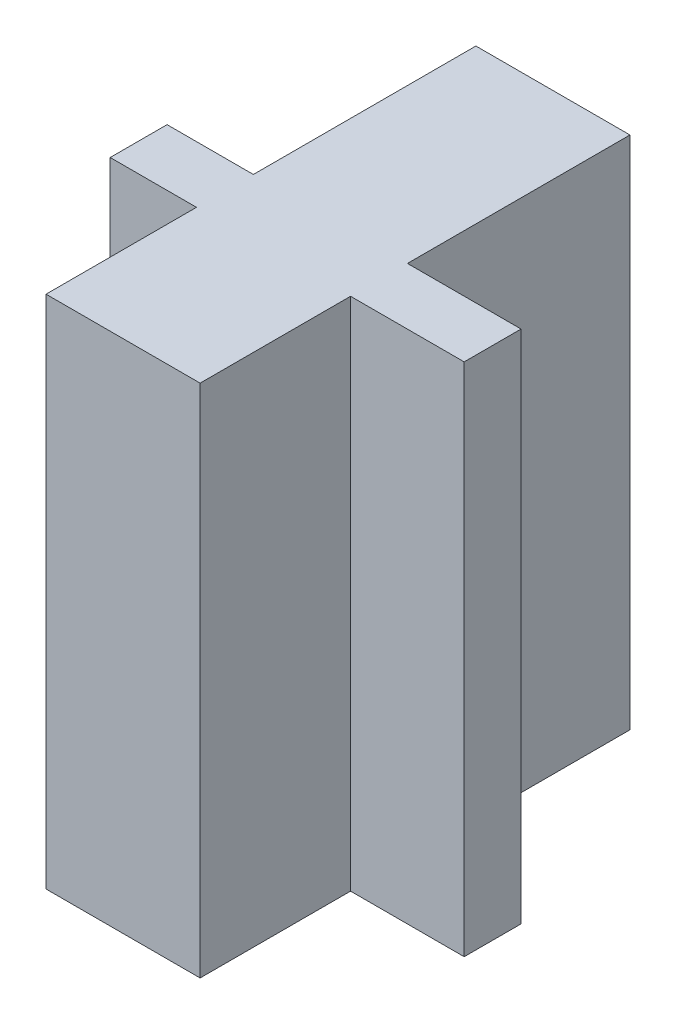
ISO-10303-21;
HEADER;
FILE_DESCRIPTION(('STEP AP214'),'2;1');
FILE_NAME('part.step','',(''),(''),'','','');
FILE_SCHEMA(('AUTOMOTIVE_DESIGN { 1 0 10303 214 1 1 1 1 }'));
ENDSEC;
DATA;
#1=APPLICATION_CONTEXT('core data for automotive mechanical design processes');
#2=APPLICATION_PROTOCOL_DEFINITION('international standard','automotive_design',2000,#1);
#3=PRODUCT_CONTEXT('',#1,'mechanical');
#4=PRODUCT('Part','Part','',(#3));
#5=PRODUCT_RELATED_PRODUCT_CATEGORY('part','',(#4));
#6=PRODUCT_DEFINITION_FORMATION('','',#4);
#7=PRODUCT_DEFINITION_CONTEXT('part definition',#1,'design');
#8=PRODUCT_DEFINITION('design','',#6,#7);
#9=PRODUCT_DEFINITION_SHAPE('','',#8);
#10=(LENGTH_UNIT() NAMED_UNIT(*) SI_UNIT(.MILLI.,.METRE.));
#11=(NAMED_UNIT(*) PLANE_ANGLE_UNIT() SI_UNIT($,.RADIAN.));
#12=(NAMED_UNIT(*) SI_UNIT($,.STERADIAN.) SOLID_ANGLE_UNIT());
#13=UNCERTAINTY_MEASURE_WITH_UNIT(LENGTH_MEASURE(1.E-05),#10,'distance_accuracy_value','');
#14=(GEOMETRIC_REPRESENTATION_CONTEXT(3) GLOBAL_UNCERTAINTY_ASSIGNED_CONTEXT((#13)) GLOBAL_UNIT_ASSIGNED_CONTEXT((#10,
#11,#12)) REPRESENTATION_CONTEXT('',''));
#15=CARTESIAN_POINT('',(0.,0.,0.));
#16=DIRECTION('',(0.,0.,1.));
#17=DIRECTION('',(1.,0.,0.));
#18=AXIS2_PLACEMENT_3D('',#15,#16,#17);
#19=CARTESIAN_POINT('',(254.662844919786,2070.1,114.3));
#20=DIRECTION('',(0.,0.,-1.));
#21=DIRECTION('',(-1.,0.,0.));
#22=AXIS2_PLACEMENT_3D('',#19,#20,#21);
#23=PLANE('',#22);
#24=DIRECTION('',(1.,0.,0.));
#25=VECTOR('',#24,1.);
#26=CARTESIAN_POINT('',(254.662844919786,0.,114.3));
#27=LINE('',#26,#25);
#28=CARTESIAN_POINT('',(254.662844919786,0.,114.3));
#29=VERTEX_POINT('',#28);
#30=CARTESIAN_POINT('',(711.2,0.,114.3));
#31=VERTEX_POINT('',#30);
#32=EDGE_CURVE('E164',#29,#31,#27,.T.);
#33=ORIENTED_EDGE('',*,*,#32,.T.);
#34=DIRECTION('',(0.,-1.,0.));
#35=VECTOR('',#34,1.);
#36=CARTESIAN_POINT('',(711.2,2070.1,114.3));
#37=LINE('',#36,#35);
#38=CARTESIAN_POINT('',(711.2,2070.1,114.3));
#39=VERTEX_POINT('',#38);
#40=EDGE_CURVE('E11',#39,#31,#37,.T.);
#41=ORIENTED_EDGE('',*,*,#40,.F.);
#42=DIRECTION('',(1.,0.,0.));
#43=VECTOR('',#42,1.);
#44=CARTESIAN_POINT('',(254.662844919786,2070.1,114.3));
#45=LINE('',#44,#43);
#46=CARTESIAN_POINT('',(254.662844919786,2070.1,114.3));
#47=VERTEX_POINT('',#46);
#48=EDGE_CURVE('E198',#47,#39,#45,.T.);
#49=ORIENTED_EDGE('',*,*,#48,.F.);
#50=DIRECTION('',(0.,-1.,0.));
#51=VECTOR('',#50,1.);
#52=CARTESIAN_POINT('',(254.662844919786,2070.1,114.3));
#53=LINE('',#52,#51);
#54=EDGE_CURVE('E160',#47,#29,#53,.T.);
#55=ORIENTED_EDGE('',*,*,#54,.T.);
#56=EDGE_LOOP('',(#33,#41,#49,#55));
#57=FACE_BOUND('',#56,.T.);
#58=ADVANCED_FACE('F39',(#57),#23,.F.);
#59=CARTESIAN_POINT('',(711.2,2070.1,-114.3));
#60=DIRECTION('',(-1.,0.,0.));
#61=DIRECTION('',(0.,0.,1.));
#62=AXIS2_PLACEMENT_3D('',#59,#60,#61);
#63=PLANE('',#62);
#64=DIRECTION('',(0.,0.,-1.));
#65=VECTOR('',#64,1.);
#66=CARTESIAN_POINT('',(711.2,0.,-114.3));
#67=LINE('',#66,#65);
#68=CARTESIAN_POINT('',(711.2,0.,-114.3));
#69=VERTEX_POINT('',#68);
#70=EDGE_CURVE('E168',#31,#69,#67,.T.);
#71=ORIENTED_EDGE('',*,*,#70,.T.);
#72=DIRECTION('',(0.,-1.,0.));
#73=VECTOR('',#72,1.);
#74=CARTESIAN_POINT('',(711.2,2070.1,-114.3));
#75=LINE('',#74,#73);
#76=CARTESIAN_POINT('',(711.2,2070.1,-114.3));
#77=VERTEX_POINT('',#76);
#78=EDGE_CURVE('E48',#77,#69,#75,.T.);
#79=ORIENTED_EDGE('',*,*,#78,.F.);
#80=DIRECTION('',(0.,0.,-1.));
#81=VECTOR('',#80,1.);
#82=CARTESIAN_POINT('',(711.2,2070.1,-114.3));
#83=LINE('',#82,#81);
#84=EDGE_CURVE('E111',#39,#77,#83,.T.);
#85=ORIENTED_EDGE('',*,*,#84,.F.);
#86=ORIENTED_EDGE('',*,*,#40,.T.);
#87=EDGE_LOOP('',(#71,#79,#85,#86));
#88=FACE_BOUND('',#87,.T.);
#89=ADVANCED_FACE('F292',(#88),#63,.F.);
#90=CARTESIAN_POINT('',(254.662844919786,2070.1,-114.3));
#91=DIRECTION('',(0.,0.,1.));
#92=DIRECTION('',(1.,0.,0.));
#93=AXIS2_PLACEMENT_3D('',#90,#91,#92);
#94=PLANE('',#93);
#95=DIRECTION('',(-1.,0.,0.));
#96=VECTOR('',#95,1.);
#97=CARTESIAN_POINT('',(254.662844919786,0.,-114.3));
#98=LINE('',#97,#96);
#99=CARTESIAN_POINT('',(254.662844919786,0.,-114.3));
#100=VERTEX_POINT('',#99);
#101=EDGE_CURVE('E171',#69,#100,#98,.T.);
#102=ORIENTED_EDGE('',*,*,#101,.T.);
#103=DIRECTION('',(0.,-1.,0.));
#104=VECTOR('',#103,1.);
#105=CARTESIAN_POINT('',(254.662844919786,2070.1,-114.3));
#106=LINE('',#105,#104);
#107=CARTESIAN_POINT('',(254.662844919786,2070.1,-114.3));
#108=VERTEX_POINT('',#107);
#109=EDGE_CURVE('E225',#108,#100,#106,.T.);
#110=ORIENTED_EDGE('',*,*,#109,.F.);
#111=DIRECTION('',(-1.,0.,0.));
#112=VECTOR('',#111,1.);
#113=CARTESIAN_POINT('',(254.662844919786,2070.1,-114.3));
#114=LINE('',#113,#112);
#115=EDGE_CURVE('E235',#77,#108,#114,.T.);
#116=ORIENTED_EDGE('',*,*,#115,.F.);
#117=ORIENTED_EDGE('',*,*,#78,.T.);
#118=EDGE_LOOP('',(#102,#110,#116,#117));
#119=FACE_BOUND('',#118,.T.);
#120=ADVANCED_FACE('F233',(#119),#94,.F.);
#121=CARTESIAN_POINT('',(254.662844919786,2070.1,-1008.3935828877));
#122=DIRECTION('',(-1.,0.,0.));
#123=DIRECTION('',(0.,0.,1.));
#124=AXIS2_PLACEMENT_3D('',#121,#122,#123);
#125=PLANE('',#124);
#126=DIRECTION('',(0.,0.,-1.));
#127=VECTOR('',#126,1.);
#128=CARTESIAN_POINT('',(254.662844919786,0.,-1008.3935828877));
#129=LINE('',#128,#127);
#130=CARTESIAN_POINT('',(254.662844919786,0.,-1008.3935828877));
#131=VERTEX_POINT('',#130);
#132=EDGE_CURVE('E174',#100,#131,#129,.T.);
#133=ORIENTED_EDGE('',*,*,#132,.T.);
#134=DIRECTION('',(0.,-1.,0.));
#135=VECTOR('',#134,1.);
#136=CARTESIAN_POINT('',(254.662844919786,2070.1,-1008.3935828877));
#137=LINE('',#136,#135);
#138=CARTESIAN_POINT('',(254.662844919786,2070.1,-1008.3935828877));
#139=VERTEX_POINT('',#138);
#140=EDGE_CURVE('E221',#139,#131,#137,.T.);
#141=ORIENTED_EDGE('',*,*,#140,.F.);
#142=DIRECTION('',(0.,0.,-1.));
#143=VECTOR('',#142,1.);
#144=CARTESIAN_POINT('',(254.662844919786,2070.1,-1008.3935828877));
#145=LINE('',#144,#143);
#146=EDGE_CURVE('E254',#108,#139,#145,.T.);
#147=ORIENTED_EDGE('',*,*,#146,.F.);
#148=ORIENTED_EDGE('',*,*,#109,.T.);
#149=EDGE_LOOP('',(#133,#141,#147,#148));
#150=FACE_BOUND('',#149,.T.);
#151=ADVANCED_FACE('F244',(#150),#125,.F.);
#152=CARTESIAN_POINT('',(-364.462155080214,2070.1,-1008.3935828877));
#153=DIRECTION('',(0.,0.,1.));
#154=DIRECTION('',(1.,0.,0.));
#155=AXIS2_PLACEMENT_3D('',#152,#153,#154);
#156=PLANE('',#155);
#157=DIRECTION('',(-1.,0.,0.));
#158=VECTOR('',#157,1.);
#159=CARTESIAN_POINT('',(-364.462155080214,0.,-1008.3935828877));
#160=LINE('',#159,#158);
#161=CARTESIAN_POINT('',(-364.462155080214,0.,-1008.3935828877));
#162=VERTEX_POINT('',#161);
#163=EDGE_CURVE('E177',#131,#162,#160,.T.);
#164=ORIENTED_EDGE('',*,*,#163,.T.);
#165=DIRECTION('',(0.,-1.,0.));
#166=VECTOR('',#165,1.);
#167=CARTESIAN_POINT('',(-364.462155080214,2070.1,-1008.3935828877));
#168=LINE('',#167,#166);
#169=CARTESIAN_POINT('',(-364.462155080214,2070.1,-1008.3935828877));
#170=VERTEX_POINT('',#169);
#171=EDGE_CURVE('E217',#170,#162,#168,.T.);
#172=ORIENTED_EDGE('',*,*,#171,.F.);
#173=DIRECTION('',(-1.,0.,0.));
#174=VECTOR('',#173,1.);
#175=CARTESIAN_POINT('',(-364.462155080214,2070.1,-1008.3935828877));
#176=LINE('',#175,#174);
#177=EDGE_CURVE('E250',#139,#170,#176,.T.);
#178=ORIENTED_EDGE('',*,*,#177,.F.);
#179=ORIENTED_EDGE('',*,*,#140,.T.);
#180=EDGE_LOOP('',(#164,#172,#178,#179));
#181=FACE_BOUND('',#180,.T.);
#182=ADVANCED_FACE('F248',(#181),#156,.F.);
#183=CARTESIAN_POINT('',(-364.462155080214,2070.1,-1008.3935828877));
#184=DIRECTION('',(1.,0.,0.));
#185=DIRECTION('',(0.,0.,-1.));
#186=AXIS2_PLACEMENT_3D('',#183,#184,#185);
#187=PLANE('',#186);
#188=DIRECTION('',(0.,0.,1.));
#189=VECTOR('',#188,1.);
#190=CARTESIAN_POINT('',(-364.462155080214,0.,-1008.3935828877));
#191=LINE('',#190,#189);
#192=CARTESIAN_POINT('',(-364.462155080214,0.,-114.3));
#193=VERTEX_POINT('',#192);
#194=EDGE_CURVE('E180',#162,#193,#191,.T.);
#195=ORIENTED_EDGE('',*,*,#194,.T.);
#196=DIRECTION('',(0.,-1.,0.));
#197=VECTOR('',#196,1.);
#198=CARTESIAN_POINT('',(-364.462155080214,2070.1,-114.3));
#199=LINE('',#198,#197);
#200=CARTESIAN_POINT('',(-364.462155080214,2070.1,-114.3));
#201=VERTEX_POINT('',#200);
#202=EDGE_CURVE('E213',#201,#193,#199,.T.);
#203=ORIENTED_EDGE('',*,*,#202,.F.);
#204=DIRECTION('',(0.,0.,1.));
#205=VECTOR('',#204,1.);
#206=CARTESIAN_POINT('',(-364.462155080214,2070.1,-1008.3935828877));
#207=LINE('',#206,#205);
#208=EDGE_CURVE('E253',#170,#201,#207,.T.);
#209=ORIENTED_EDGE('',*,*,#208,.F.);
#210=ORIENTED_EDGE('',*,*,#171,.T.);
#211=EDGE_LOOP('',(#195,#203,#209,#210));
#212=FACE_BOUND('',#211,.T.);
#213=ADVANCED_FACE('F305',(#212),#187,.F.);
#214=CARTESIAN_POINT('',(-711.2,2070.1,-114.3));
#215=DIRECTION('',(0.,0.,1.));
#216=DIRECTION('',(1.,0.,0.));
#217=AXIS2_PLACEMENT_3D('',#214,#215,#216);
#218=PLANE('',#217);
#219=DIRECTION('',(-1.,0.,0.));
#220=VECTOR('',#219,1.);
#221=CARTESIAN_POINT('',(-711.2,0.,-114.3));
#222=LINE('',#221,#220);
#223=CARTESIAN_POINT('',(-711.2,0.,-114.3));
#224=VERTEX_POINT('',#223);
#225=EDGE_CURVE('E183',#193,#224,#222,.T.);
#226=ORIENTED_EDGE('',*,*,#225,.T.);
#227=DIRECTION('',(0.,-1.,0.));
#228=VECTOR('',#227,1.);
#229=CARTESIAN_POINT('',(-711.2,2070.1,-114.3));
#230=LINE('',#229,#228);
#231=CARTESIAN_POINT('',(-711.2,2070.1,-114.3));
#232=VERTEX_POINT('',#231);
#233=EDGE_CURVE('E209',#232,#224,#230,.T.);
#234=ORIENTED_EDGE('',*,*,#233,.F.);
#235=DIRECTION('',(-1.,0.,0.));
#236=VECTOR('',#235,1.);
#237=CARTESIAN_POINT('',(-711.2,2070.1,-114.3));
#238=LINE('',#237,#236);
#239=EDGE_CURVE('E258',#201,#232,#238,.T.);
#240=ORIENTED_EDGE('',*,*,#239,.F.);
#241=ORIENTED_EDGE('',*,*,#202,.T.);
#242=EDGE_LOOP('',(#226,#234,#240,#241));
#243=FACE_BOUND('',#242,.T.);
#244=ADVANCED_FACE('F308',(#243),#218,.F.);
#245=CARTESIAN_POINT('',(-711.2,2070.1,-114.3));
#246=DIRECTION('',(1.,0.,0.));
#247=DIRECTION('',(0.,0.,-1.));
#248=AXIS2_PLACEMENT_3D('',#245,#246,#247);
#249=PLANE('',#248);
#250=DIRECTION('',(0.,0.,1.));
#251=VECTOR('',#250,1.);
#252=CARTESIAN_POINT('',(-711.2,0.,-114.3));
#253=LINE('',#252,#251);
#254=CARTESIAN_POINT('',(-711.2,0.,114.3));
#255=VERTEX_POINT('',#254);
#256=EDGE_CURVE('E186',#224,#255,#253,.T.);
#257=ORIENTED_EDGE('',*,*,#256,.T.);
#258=DIRECTION('',(0.,-1.,0.));
#259=VECTOR('',#258,1.);
#260=CARTESIAN_POINT('',(-711.2,2070.1,114.3));
#261=LINE('',#260,#259);
#262=CARTESIAN_POINT('',(-711.2,2070.1,114.3));
#263=VERTEX_POINT('',#262);
#264=EDGE_CURVE('E205',#263,#255,#261,.T.);
#265=ORIENTED_EDGE('',*,*,#264,.F.);
#266=DIRECTION('',(0.,0.,1.));
#267=VECTOR('',#266,1.);
#268=CARTESIAN_POINT('',(-711.2,2070.1,-114.3));
#269=LINE('',#268,#267);
#270=EDGE_CURVE('E265',#232,#263,#269,.T.);
#271=ORIENTED_EDGE('',*,*,#270,.F.);
#272=ORIENTED_EDGE('',*,*,#233,.T.);
#273=EDGE_LOOP('',(#257,#265,#271,#272));
#274=FACE_BOUND('',#273,.T.);
#275=ADVANCED_FACE('F273',(#274),#249,.F.);
#276=CARTESIAN_POINT('',(-711.2,2070.1,114.3));
#277=DIRECTION('',(0.,0.,-1.));
#278=DIRECTION('',(-1.,0.,0.));
#279=AXIS2_PLACEMENT_3D('',#276,#277,#278);
#280=PLANE('',#279);
#281=DIRECTION('',(1.,0.,0.));
#282=VECTOR('',#281,1.);
#283=CARTESIAN_POINT('',(-711.2,0.,114.3));
#284=LINE('',#283,#282);
#285=CARTESIAN_POINT('',(-364.462155080214,0.,114.3));
#286=VERTEX_POINT('',#285);
#287=EDGE_CURVE('E189',#255,#286,#284,.T.);
#288=ORIENTED_EDGE('',*,*,#287,.T.);
#289=DIRECTION('',(0.,-1.,0.));
#290=VECTOR('',#289,1.);
#291=CARTESIAN_POINT('',(-364.462155080214,2070.1,114.3));
#292=LINE('',#291,#290);
#293=CARTESIAN_POINT('',(-364.462155080214,2070.1,114.3));
#294=VERTEX_POINT('',#293);
#295=EDGE_CURVE('E153',#294,#286,#292,.T.);
#296=ORIENTED_EDGE('',*,*,#295,.F.);
#297=DIRECTION('',(1.,0.,0.));
#298=VECTOR('',#297,1.);
#299=CARTESIAN_POINT('',(-711.2,2070.1,114.3));
#300=LINE('',#299,#298);
#301=EDGE_CURVE('E142',#263,#294,#300,.T.);
#302=ORIENTED_EDGE('',*,*,#301,.F.);
#303=ORIENTED_EDGE('',*,*,#264,.T.);
#304=EDGE_LOOP('',(#288,#296,#302,#303));
#305=FACE_BOUND('',#304,.T.);
#306=ADVANCED_FACE('F277',(#305),#280,.F.);
#307=CARTESIAN_POINT('',(-364.462155080214,2070.1,114.3));
#308=DIRECTION('',(1.,0.,0.));
#309=DIRECTION('',(0.,0.,-1.));
#310=AXIS2_PLACEMENT_3D('',#307,#308,#309);
#311=PLANE('',#310);
#312=DIRECTION('',(0.,0.,1.));
#313=VECTOR('',#312,1.);
#314=CARTESIAN_POINT('',(-364.462155080214,0.,114.3));
#315=LINE('',#314,#313);
#316=CARTESIAN_POINT('',(-364.462155080214,0.,718.806417112299));
#317=VERTEX_POINT('',#316);
#318=EDGE_CURVE('E151',#286,#317,#315,.T.);
#319=ORIENTED_EDGE('',*,*,#318,.T.);
#320=DIRECTION('',(0.,-1.,0.));
#321=VECTOR('',#320,1.);
#322=CARTESIAN_POINT('',(-364.462155080214,2070.1,718.806417112299));
#323=LINE('',#322,#321);
#324=CARTESIAN_POINT('',(-364.462155080214,2070.1,718.806417112299));
#325=VERTEX_POINT('',#324);
#326=EDGE_CURVE('E148',#325,#317,#323,.T.);
#327=ORIENTED_EDGE('',*,*,#326,.F.);
#328=DIRECTION('',(0.,0.,1.));
#329=VECTOR('',#328,1.);
#330=CARTESIAN_POINT('',(-364.462155080214,2070.1,114.3));
#331=LINE('',#330,#329);
#332=EDGE_CURVE('E136',#294,#325,#331,.T.);
#333=ORIENTED_EDGE('',*,*,#332,.F.);
#334=ORIENTED_EDGE('',*,*,#295,.T.);
#335=EDGE_LOOP('',(#319,#327,#333,#334));
#336=FACE_BOUND('',#335,.T.);
#337=ADVANCED_FACE('F149',(#336),#311,.F.);
#338=CARTESIAN_POINT('',(-364.462155080214,2070.1,718.806417112299));
#339=DIRECTION('',(0.,0.,-1.));
#340=DIRECTION('',(-1.,0.,0.));
#341=AXIS2_PLACEMENT_3D('',#338,#339,#340);
#342=PLANE('',#341);
#343=DIRECTION('',(1.,0.,0.));
#344=VECTOR('',#343,1.);
#345=CARTESIAN_POINT('',(-364.462155080214,0.,718.806417112299));
#346=LINE('',#345,#344);
#347=CARTESIAN_POINT('',(254.662844919786,0.,718.806417112299));
#348=VERTEX_POINT('',#347);
#349=EDGE_CURVE('E97',#317,#348,#346,.T.);
#350=ORIENTED_EDGE('',*,*,#349,.T.);
#351=DIRECTION('',(0.,-1.,0.));
#352=VECTOR('',#351,1.);
#353=CARTESIAN_POINT('',(254.662844919786,2070.1,718.806417112299));
#354=LINE('',#353,#352);
#355=CARTESIAN_POINT('',(254.662844919786,2070.1,718.806417112299));
#356=VERTEX_POINT('',#355);
#357=EDGE_CURVE('E154',#356,#348,#354,.T.);
#358=ORIENTED_EDGE('',*,*,#357,.F.);
#359=DIRECTION('',(1.,0.,0.));
#360=VECTOR('',#359,1.);
#361=CARTESIAN_POINT('',(-364.462155080214,2070.1,718.806417112299));
#362=LINE('',#361,#360);
#363=EDGE_CURVE('E140',#325,#356,#362,.T.);
#364=ORIENTED_EDGE('',*,*,#363,.F.);
#365=ORIENTED_EDGE('',*,*,#326,.T.);
#366=EDGE_LOOP('',(#350,#358,#364,#365));
#367=FACE_BOUND('',#366,.T.);
#368=ADVANCED_FACE('F156',(#367),#342,.F.);
#369=CARTESIAN_POINT('',(254.662844919786,2070.1,114.3));
#370=DIRECTION('',(-1.,0.,0.));
#371=DIRECTION('',(0.,0.,1.));
#372=AXIS2_PLACEMENT_3D('',#369,#370,#371);
#373=PLANE('',#372);
#374=DIRECTION('',(0.,0.,-1.));
#375=VECTOR('',#374,1.);
#376=CARTESIAN_POINT('',(254.662844919786,0.,114.3));
#377=LINE('',#376,#375);
#378=EDGE_CURVE('E103',#348,#29,#377,.T.);
#379=ORIENTED_EDGE('',*,*,#378,.T.);
#380=ORIENTED_EDGE('',*,*,#54,.F.);
#381=DIRECTION('',(0.,0.,-1.));
#382=VECTOR('',#381,1.);
#383=CARTESIAN_POINT('',(254.662844919786,2070.1,114.3));
#384=LINE('',#383,#382);
#385=EDGE_CURVE('E56',#356,#47,#384,.T.);
#386=ORIENTED_EDGE('',*,*,#385,.F.);
#387=ORIENTED_EDGE('',*,*,#357,.T.);
#388=EDGE_LOOP('',(#379,#380,#386,#387));
#389=FACE_BOUND('',#388,.T.);
#390=ADVANCED_FACE('F281',(#389),#373,.F.);
#391=CARTESIAN_POINT('',(0.,2070.1,0.));
#392=DIRECTION('',(0.,-1.,0.));
#393=DIRECTION('',(0.,0.,-1.));
#394=AXIS2_PLACEMENT_3D('',#391,#392,#393);
#395=PLANE('',#394);
#396=ORIENTED_EDGE('',*,*,#48,.T.);
#397=ORIENTED_EDGE('',*,*,#84,.T.);
#398=ORIENTED_EDGE('',*,*,#115,.T.);
#399=ORIENTED_EDGE('',*,*,#146,.T.);
#400=ORIENTED_EDGE('',*,*,#177,.T.);
#401=ORIENTED_EDGE('',*,*,#208,.T.);
#402=ORIENTED_EDGE('',*,*,#239,.T.);
#403=ORIENTED_EDGE('',*,*,#270,.T.);
#404=ORIENTED_EDGE('',*,*,#301,.T.);
#405=ORIENTED_EDGE('',*,*,#332,.T.);
#406=ORIENTED_EDGE('',*,*,#363,.T.);
#407=ORIENTED_EDGE('',*,*,#385,.T.);
#408=EDGE_LOOP('',(#396,#397,#398,#399,#400,#401,#402,#403,#404,#405,#406,#407));
#409=FACE_BOUND('',#408,.T.);
#410=ADVANCED_FACE('F138',(#409),#395,.F.);
#411=CARTESIAN_POINT('',(0.,0.,0.));
#412=DIRECTION('',(0.,-1.,0.));
#413=DIRECTION('',(0.,0.,-1.));
#414=AXIS2_PLACEMENT_3D('',#411,#412,#413);
#415=PLANE('',#414);
#416=ORIENTED_EDGE('',*,*,#32,.F.);
#417=ORIENTED_EDGE('',*,*,#378,.F.);
#418=ORIENTED_EDGE('',*,*,#349,.F.);
#419=ORIENTED_EDGE('',*,*,#318,.F.);
#420=ORIENTED_EDGE('',*,*,#287,.F.);
#421=ORIENTED_EDGE('',*,*,#256,.F.);
#422=ORIENTED_EDGE('',*,*,#225,.F.);
#423=ORIENTED_EDGE('',*,*,#194,.F.);
#424=ORIENTED_EDGE('',*,*,#163,.F.);
#425=ORIENTED_EDGE('',*,*,#132,.F.);
#426=ORIENTED_EDGE('',*,*,#101,.F.);
#427=ORIENTED_EDGE('',*,*,#70,.F.);
#428=EDGE_LOOP('',(#416,#417,#418,#419,#420,#421,#422,#423,#424,#425,#426,#427));
#429=FACE_BOUND('',#428,.T.);
#430=ADVANCED_FACE('F239',(#429),#415,.T.);
#431=CLOSED_SHELL('',(#58,#89,#120,#151,#182,#213,#244,#275,#306,#337,#368,#390,#410,#430));
#432=MANIFOLD_SOLID_BREP('B2',#431);
#433=ADVANCED_BREP_SHAPE_REPRESENTATION('',(#18,#432),#14);
#434=SHAPE_DEFINITION_REPRESENTATION(#9,#433);
ENDSEC;
END-ISO-10303-21;
